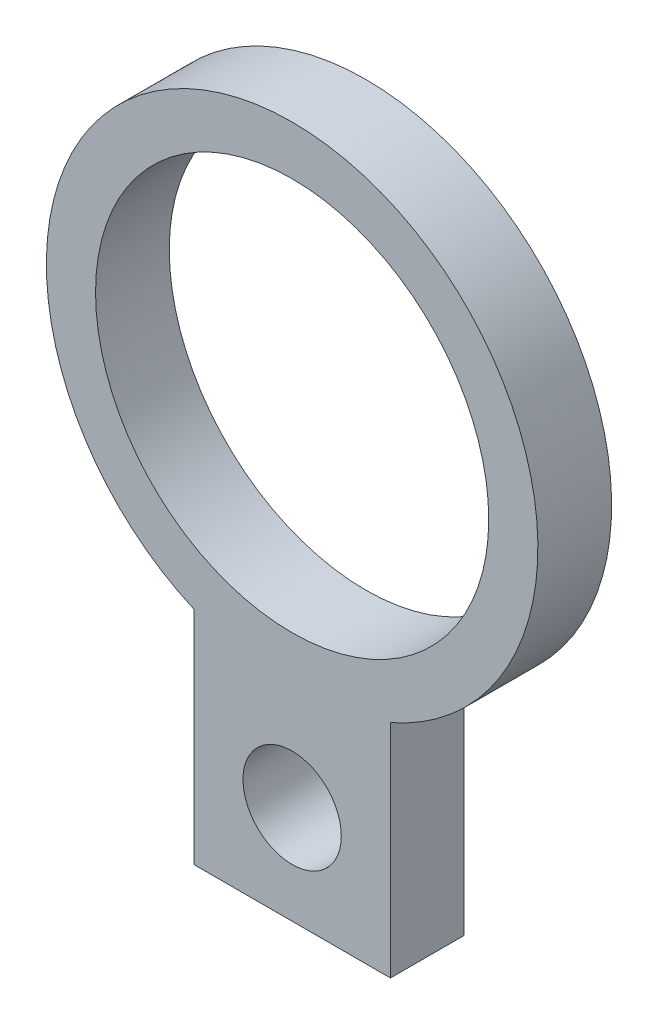
ISO-10303-21;
HEADER;
FILE_DESCRIPTION(('STEP AP214'),'2;1');
FILE_NAME('part.step','',(''),(''),'','','');
FILE_SCHEMA(('AUTOMOTIVE_DESIGN { 1 0 10303 214 1 1 1 1 }'));
ENDSEC;
DATA;
#1=APPLICATION_CONTEXT('core data for automotive mechanical design processes');
#2=APPLICATION_PROTOCOL_DEFINITION('international standard','automotive_design',2000,#1);
#3=PRODUCT_CONTEXT('',#1,'mechanical');
#4=PRODUCT('Part','Part','',(#3));
#5=PRODUCT_RELATED_PRODUCT_CATEGORY('part','',(#4));
#6=PRODUCT_DEFINITION_FORMATION('','',#4);
#7=PRODUCT_DEFINITION_CONTEXT('part definition',#1,'design');
#8=PRODUCT_DEFINITION('design','',#6,#7);
#9=PRODUCT_DEFINITION_SHAPE('','',#8);
#10=(LENGTH_UNIT() NAMED_UNIT(*) SI_UNIT(.MILLI.,.METRE.));
#11=(NAMED_UNIT(*) PLANE_ANGLE_UNIT() SI_UNIT($,.RADIAN.));
#12=(NAMED_UNIT(*) SI_UNIT($,.STERADIAN.) SOLID_ANGLE_UNIT());
#13=UNCERTAINTY_MEASURE_WITH_UNIT(LENGTH_MEASURE(1.E-05),#10,'distance_accuracy_value','');
#14=(GEOMETRIC_REPRESENTATION_CONTEXT(3) GLOBAL_UNCERTAINTY_ASSIGNED_CONTEXT((#13)) GLOBAL_UNIT_ASSIGNED_CONTEXT((#10,
#11,#12)) REPRESENTATION_CONTEXT('',''));
#15=CARTESIAN_POINT('',(0.,0.,0.));
#16=DIRECTION('',(0.,0.,1.));
#17=DIRECTION('',(1.,0.,0.));
#18=AXIS2_PLACEMENT_3D('',#15,#16,#17);
#19=CARTESIAN_POINT('',(0.,0.,1.5));
#20=DIRECTION('',(0.,0.,1.));
#21=DIRECTION('',(1.,0.,0.));
#22=AXIS2_PLACEMENT_3D('',#19,#20,#21);
#23=PLANE('',#22);
#24=CARTESIAN_POINT('',(0.,0.,1.5));
#25=DIRECTION('',(0.,0.,1.));
#26=DIRECTION('',(1.,0.,0.));
#27=AXIS2_PLACEMENT_3D('',#24,#25,#26);
#28=CIRCLE('',#27,4.);
#29=CARTESIAN_POINT('',(4.,0.,1.5));
#30=VERTEX_POINT('',#29);
#31=EDGE_CURVE('E112',#30,#30,#28,.T.);
#32=ORIENTED_EDGE('',*,*,#31,.F.);
#33=EDGE_LOOP('',(#32));
#34=FACE_BOUND('',#33,.T.);
#35=DIRECTION('',(0.,1.,0.));
#36=VECTOR('',#35,1.);
#37=CARTESIAN_POINT('',(2.,-9.08257569495584,1.5));
#38=LINE('',#37,#36);
#39=CARTESIAN_POINT('',(2.,-9.08257569495584,1.5));
#40=VERTEX_POINT('',#39);
#41=CARTESIAN_POINT('',(2.,-4.58257569495584,1.5));
#42=VERTEX_POINT('',#41);
#43=EDGE_CURVE('E92',#40,#42,#38,.T.);
#44=ORIENTED_EDGE('',*,*,#43,.T.);
#45=CARTESIAN_POINT('',(0.,0.,1.5));
#46=DIRECTION('',(0.,0.,1.));
#47=DIRECTION('',(1.,0.,0.));
#48=AXIS2_PLACEMENT_3D('',#45,#46,#47);
#49=CIRCLE('',#48,5.);
#50=CARTESIAN_POINT('',(-2.,-4.58257569495584,1.5));
#51=VERTEX_POINT('',#50);
#52=EDGE_CURVE('E87',#42,#51,#49,.T.);
#53=ORIENTED_EDGE('',*,*,#52,.T.);
#54=DIRECTION('',(0.,-1.,0.));
#55=VECTOR('',#54,1.);
#56=CARTESIAN_POINT('',(-2.,-4.58257569495584,1.5));
#57=LINE('',#56,#55);
#58=CARTESIAN_POINT('',(-2.,-9.08257569495584,1.5));
#59=VERTEX_POINT('',#58);
#60=EDGE_CURVE('E90',#51,#59,#57,.T.);
#61=ORIENTED_EDGE('',*,*,#60,.T.);
#62=DIRECTION('',(1.,0.,0.));
#63=VECTOR('',#62,1.);
#64=CARTESIAN_POINT('',(-2.,-9.08257569495584,1.5));
#65=LINE('',#64,#63);
#66=EDGE_CURVE('E57',#59,#40,#65,.T.);
#67=ORIENTED_EDGE('',*,*,#66,.T.);
#68=EDGE_LOOP('',(#44,#53,#61,#67));
#69=FACE_BOUND('',#68,.T.);
#70=CARTESIAN_POINT('',(0.,-7.08257569495584,1.5));
#71=DIRECTION('',(0.,0.,1.));
#72=DIRECTION('',(1.,0.,0.));
#73=AXIS2_PLACEMENT_3D('',#70,#71,#72);
#74=CIRCLE('',#73,1.);
#75=CARTESIAN_POINT('',(1.,-7.08257569495584,1.5));
#76=VERTEX_POINT('',#75);
#77=EDGE_CURVE('E134',#76,#76,#74,.T.);
#78=ORIENTED_EDGE('',*,*,#77,.F.);
#79=EDGE_LOOP('',(#78));
#80=FACE_BOUND('',#79,.T.);
#81=ADVANCED_FACE('F39',(#34,#69,#80),#23,.T.);
#82=CARTESIAN_POINT('',(0.,0.,0.));
#83=DIRECTION('',(0.,0.,1.));
#84=DIRECTION('',(1.,0.,0.));
#85=AXIS2_PLACEMENT_3D('',#82,#83,#84);
#86=PLANE('',#85);
#87=DIRECTION('',(0.,1.,0.));
#88=VECTOR('',#87,1.);
#89=CARTESIAN_POINT('',(2.,-9.08257569495584,0.));
#90=LINE('',#89,#88);
#91=CARTESIAN_POINT('',(2.,-9.08257569495584,0.));
#92=VERTEX_POINT('',#91);
#93=CARTESIAN_POINT('',(2.,-4.58257569495584,0.));
#94=VERTEX_POINT('',#93);
#95=EDGE_CURVE('E108',#92,#94,#90,.T.);
#96=ORIENTED_EDGE('',*,*,#95,.F.);
#97=DIRECTION('',(1.,0.,0.));
#98=VECTOR('',#97,1.);
#99=CARTESIAN_POINT('',(-2.,-9.08257569495584,0.));
#100=LINE('',#99,#98);
#101=CARTESIAN_POINT('',(-2.,-9.08257569495584,0.));
#102=VERTEX_POINT('',#101);
#103=EDGE_CURVE('E80',#102,#92,#100,.T.);
#104=ORIENTED_EDGE('',*,*,#103,.F.);
#105=DIRECTION('',(0.,-1.,0.));
#106=VECTOR('',#105,1.);
#107=CARTESIAN_POINT('',(-2.,-4.58257569495584,0.));
#108=LINE('',#107,#106);
#109=CARTESIAN_POINT('',(-2.,-4.58257569495584,0.));
#110=VERTEX_POINT('',#109);
#111=EDGE_CURVE('E74',#110,#102,#108,.T.);
#112=ORIENTED_EDGE('',*,*,#111,.F.);
#113=CARTESIAN_POINT('',(0.,0.,0.));
#114=DIRECTION('',(0.,0.,1.));
#115=DIRECTION('',(1.,0.,0.));
#116=AXIS2_PLACEMENT_3D('',#113,#114,#115);
#117=CIRCLE('',#116,5.);
#118=EDGE_CURVE('E97',#94,#110,#117,.T.);
#119=ORIENTED_EDGE('',*,*,#118,.F.);
#120=EDGE_LOOP('',(#96,#104,#112,#119));
#121=FACE_BOUND('',#120,.T.);
#122=CARTESIAN_POINT('',(0.,0.,0.));
#123=DIRECTION('',(0.,0.,1.));
#124=DIRECTION('',(1.,0.,0.));
#125=AXIS2_PLACEMENT_3D('',#122,#123,#124);
#126=CIRCLE('',#125,4.);
#127=CARTESIAN_POINT('',(4.,0.,0.));
#128=VERTEX_POINT('',#127);
#129=EDGE_CURVE('E130',#128,#128,#126,.T.);
#130=ORIENTED_EDGE('',*,*,#129,.T.);
#131=EDGE_LOOP('',(#130));
#132=FACE_BOUND('',#131,.T.);
#133=CARTESIAN_POINT('',(0.,-7.08257569495584,0.));
#134=DIRECTION('',(0.,0.,1.));
#135=DIRECTION('',(1.,0.,0.));
#136=AXIS2_PLACEMENT_3D('',#133,#134,#135);
#137=CIRCLE('',#136,1.);
#138=CARTESIAN_POINT('',(1.,-7.08257569495584,0.));
#139=VERTEX_POINT('',#138);
#140=EDGE_CURVE('E138',#139,#139,#137,.T.);
#141=ORIENTED_EDGE('',*,*,#140,.T.);
#142=EDGE_LOOP('',(#141));
#143=FACE_BOUND('',#142,.T.);
#144=ADVANCED_FACE('F125',(#121,#132,#143),#86,.F.);
#145=CARTESIAN_POINT('',(2.,-9.08257569495584,1.5));
#146=DIRECTION('',(-1.,0.,0.));
#147=DIRECTION('',(0.,0.,1.));
#148=AXIS2_PLACEMENT_3D('',#145,#146,#147);
#149=PLANE('',#148);
#150=ORIENTED_EDGE('',*,*,#95,.T.);
#151=DIRECTION('',(0.,0.,-1.));
#152=VECTOR('',#151,1.);
#153=CARTESIAN_POINT('',(2.,-4.58257569495584,1.5));
#154=LINE('',#153,#152);
#155=EDGE_CURVE('E11',#42,#94,#154,.T.);
#156=ORIENTED_EDGE('',*,*,#155,.F.);
#157=ORIENTED_EDGE('',*,*,#43,.F.);
#158=DIRECTION('',(0.,0.,-1.));
#159=VECTOR('',#158,1.);
#160=CARTESIAN_POINT('',(2.,-9.08257569495584,1.5));
#161=LINE('',#160,#159);
#162=EDGE_CURVE('E104',#40,#92,#161,.T.);
#163=ORIENTED_EDGE('',*,*,#162,.T.);
#164=EDGE_LOOP('',(#150,#156,#157,#163));
#165=FACE_BOUND('',#164,.T.);
#166=ADVANCED_FACE('F41',(#165),#149,.F.);
#167=CARTESIAN_POINT('',(0.,0.,1.5));
#168=DIRECTION('',(0.,0.,-1.));
#169=DIRECTION('',(-1.,0.,0.));
#170=AXIS2_PLACEMENT_3D('',#167,#168,#169);
#171=CYLINDRICAL_SURFACE('',#170,5.);
#172=ORIENTED_EDGE('',*,*,#118,.T.);
#173=DIRECTION('',(0.,0.,-1.));
#174=VECTOR('',#173,1.);
#175=CARTESIAN_POINT('',(-2.,-4.58257569495584,1.5));
#176=LINE('',#175,#174);
#177=EDGE_CURVE('E49',#51,#110,#176,.T.);
#178=ORIENTED_EDGE('',*,*,#177,.F.);
#179=ORIENTED_EDGE('',*,*,#52,.F.);
#180=ORIENTED_EDGE('',*,*,#155,.T.);
#181=EDGE_LOOP('',(#172,#178,#179,#180));
#182=FACE_BOUND('',#181,.T.);
#183=ADVANCED_FACE('F96',(#182),#171,.T.);
#184=CARTESIAN_POINT('',(-2.,-4.58257569495584,1.5));
#185=DIRECTION('',(1.,0.,0.));
#186=DIRECTION('',(0.,1.,0.));
#187=AXIS2_PLACEMENT_3D('',#184,#185,#186);
#188=PLANE('',#187);
#189=ORIENTED_EDGE('',*,*,#111,.T.);
#190=DIRECTION('',(0.,0.,-1.));
#191=VECTOR('',#190,1.);
#192=CARTESIAN_POINT('',(-2.,-9.08257569495584,1.5));
#193=LINE('',#192,#191);
#194=EDGE_CURVE('E99',#59,#102,#193,.T.);
#195=ORIENTED_EDGE('',*,*,#194,.F.);
#196=ORIENTED_EDGE('',*,*,#60,.F.);
#197=ORIENTED_EDGE('',*,*,#177,.T.);
#198=EDGE_LOOP('',(#189,#195,#196,#197));
#199=FACE_BOUND('',#198,.T.);
#200=ADVANCED_FACE('F100',(#199),#188,.F.);
#201=CARTESIAN_POINT('',(-2.,-9.08257569495584,1.5));
#202=DIRECTION('',(0.,1.,0.));
#203=DIRECTION('',(-1.,0.,0.));
#204=AXIS2_PLACEMENT_3D('',#201,#202,#203);
#205=PLANE('',#204);
#206=ORIENTED_EDGE('',*,*,#103,.T.);
#207=ORIENTED_EDGE('',*,*,#162,.F.);
#208=ORIENTED_EDGE('',*,*,#66,.F.);
#209=ORIENTED_EDGE('',*,*,#194,.T.);
#210=EDGE_LOOP('',(#206,#207,#208,#209));
#211=FACE_BOUND('',#210,.T.);
#212=ADVANCED_FACE('F122',(#211),#205,.F.);
#213=CARTESIAN_POINT('',(0.,0.,1.5));
#214=DIRECTION('',(0.,0.,-1.));
#215=DIRECTION('',(-1.,0.,0.));
#216=AXIS2_PLACEMENT_3D('',#213,#214,#215);
#217=CYLINDRICAL_SURFACE('',#216,4.);
#218=ORIENTED_EDGE('',*,*,#31,.T.);
#219=EDGE_LOOP('',(#218));
#220=FACE_BOUND('',#219,.T.);
#221=ORIENTED_EDGE('',*,*,#129,.F.);
#222=EDGE_LOOP('',(#221));
#223=FACE_BOUND('',#222,.T.);
#224=ADVANCED_FACE('F157',(#220,#223),#217,.F.);
#225=CARTESIAN_POINT('',(0.,-7.08257569495584,1.5));
#226=DIRECTION('',(0.,0.,-1.));
#227=DIRECTION('',(-1.,0.,0.));
#228=AXIS2_PLACEMENT_3D('',#225,#226,#227);
#229=CYLINDRICAL_SURFACE('',#228,1.);
#230=ORIENTED_EDGE('',*,*,#77,.T.);
#231=EDGE_LOOP('',(#230));
#232=FACE_BOUND('',#231,.T.);
#233=ORIENTED_EDGE('',*,*,#140,.F.);
#234=EDGE_LOOP('',(#233));
#235=FACE_BOUND('',#234,.T.);
#236=ADVANCED_FACE('F146',(#232,#235),#229,.F.);
#237=CLOSED_SHELL('',(#81,#144,#166,#183,#200,#212,#224,#236));
#238=MANIFOLD_SOLID_BREP('B2',#237);
#239=ADVANCED_BREP_SHAPE_REPRESENTATION('',(#18,#238),#14);
#240=SHAPE_DEFINITION_REPRESENTATION(#9,#239);
ENDSEC;
END-ISO-10303-21;
